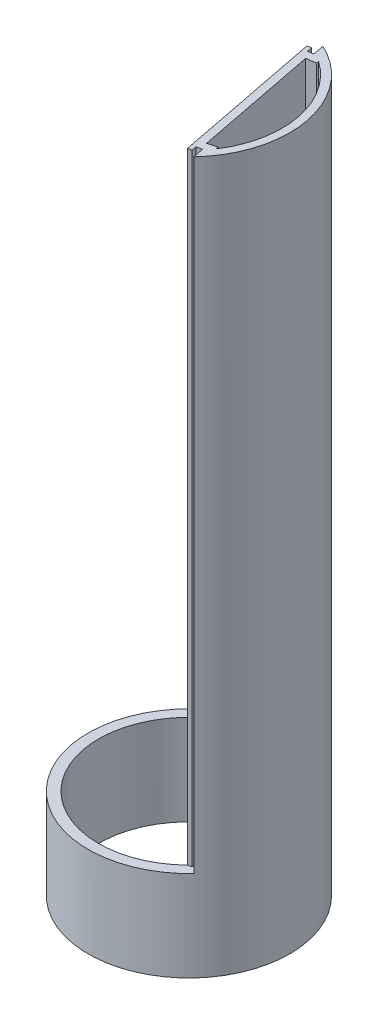
ISO-10303-21;
HEADER;
FILE_DESCRIPTION(('STEP AP214'),'2;1');
FILE_NAME('part.step','',(''),(''),'','','');
FILE_SCHEMA(('AUTOMOTIVE_DESIGN { 1 0 10303 214 1 1 1 1 }'));
ENDSEC;
DATA;
#1=APPLICATION_CONTEXT('core data for automotive mechanical design processes');
#2=APPLICATION_PROTOCOL_DEFINITION('international standard','automotive_design',2000,#1);
#3=PRODUCT_CONTEXT('',#1,'mechanical');
#4=PRODUCT('Part','Part','',(#3));
#5=PRODUCT_RELATED_PRODUCT_CATEGORY('part','',(#4));
#6=PRODUCT_DEFINITION_FORMATION('','',#4);
#7=PRODUCT_DEFINITION_CONTEXT('part definition',#1,'design');
#8=PRODUCT_DEFINITION('design','',#6,#7);
#9=PRODUCT_DEFINITION_SHAPE('','',#8);
#10=(LENGTH_UNIT() NAMED_UNIT(*) SI_UNIT(.MILLI.,.METRE.));
#11=(NAMED_UNIT(*) PLANE_ANGLE_UNIT() SI_UNIT($,.RADIAN.));
#12=(NAMED_UNIT(*) SI_UNIT($,.STERADIAN.) SOLID_ANGLE_UNIT());
#13=UNCERTAINTY_MEASURE_WITH_UNIT(LENGTH_MEASURE(1.E-05),#10,'distance_accuracy_value','');
#14=(GEOMETRIC_REPRESENTATION_CONTEXT(3) GLOBAL_UNCERTAINTY_ASSIGNED_CONTEXT((#13)) GLOBAL_UNIT_ASSIGNED_CONTEXT((#10,
#11,#12)) REPRESENTATION_CONTEXT('',''));
#15=CARTESIAN_POINT('',(0.,0.,0.));
#16=DIRECTION('',(0.,0.,1.));
#17=DIRECTION('',(1.,0.,0.));
#18=AXIS2_PLACEMENT_3D('',#15,#16,#17);
#19=CARTESIAN_POINT('',(0.,0.,0.));
#20=DIRECTION('',(0.,1.,0.));
#21=DIRECTION('',(0.,0.,1.));
#22=AXIS2_PLACEMENT_3D('',#19,#20,#21);
#23=PLANE('',#22);
#24=DIRECTION('',(-0.975925981886578,0.,0.218101989625766));
#25=VECTOR('',#24,1.);
#26=CARTESIAN_POINT('',(-3.12841036018677,0.,-13.9984828095705));
#27=LINE('',#26,#25);
#28=CARTESIAN_POINT('',(6.65548623982906,0.,-16.185008585461));
#29=VERTEX_POINT('',#28);
#30=CARTESIAN_POINT('',(6.62137484703319,0.,-16.1773852997039));
#31=VERTEX_POINT('',#30);
#32=EDGE_CURVE('E475',#29,#31,#27,.T.);
#33=ORIENTED_EDGE('',*,*,#32,.F.);
#34=CARTESIAN_POINT('',(0.,0.,0.));
#35=DIRECTION('',(0.,-1.,0.));
#36=DIRECTION('',(0.,0.,-1.));
#37=AXIS2_PLACEMENT_3D('',#34,#35,#36);
#38=CIRCLE('',#37,17.5);
#39=CARTESIAN_POINT('',(7.47812735893866,0.,-15.82174488492));
#40=VERTEX_POINT('',#39);
#41=EDGE_CURVE('E535',#29,#40,#38,.T.);
#42=ORIENTED_EDGE('',*,*,#41,.T.);
#43=DIRECTION('',(-0.192781226726572,0.,-0.981241763594374));
#44=VECTOR('',#43,1.);
#45=CARTESIAN_POINT('',(10.1931259637832,0.,-2.00260873556633));
#46=LINE('',#45,#44);
#47=CARTESIAN_POINT('',(7.5679937816583,0.,-15.3643316366767));
#48=VERTEX_POINT('',#47);
#49=EDGE_CURVE('E471',#48,#40,#46,.T.);
#50=ORIENTED_EDGE('',*,*,#49,.F.);
#51=DIRECTION('',(-0.989728291630021,0.,0.142961214135584));
#52=VECTOR('',#51,1.);
#53=CARTESIAN_POINT('',(-2.01926769541411,0.,-13.9795005142479));
#54=LINE('',#53,#52);
#55=CARTESIAN_POINT('',(8.20640860585505,0.,-15.4565474085822));
#56=VERTEX_POINT('',#55);
#57=EDGE_CURVE('E211',#56,#48,#54,.T.);
#58=ORIENTED_EDGE('',*,*,#57,.F.);
#59=CARTESIAN_POINT('',(10.1896789357499,0.,-14.227453854655));
#60=VERTEX_POINT('',#59);
#61=EDGE_CURVE('E543',#56,#60,#38,.T.);
#62=ORIENTED_EDGE('',*,*,#61,.T.);
#63=DIRECTION('',(-0.989728291630021,0.,0.142961214135584));
#64=VECTOR('',#63,1.);
#65=CARTESIAN_POINT('',(-1.80482587421073,0.,-12.4949080768028));
#66=LINE('',#65,#64);
#67=CARTESIAN_POINT('',(8.57569510727663,0.,-13.9943265489466));
#68=VERTEX_POINT('',#67);
#69=EDGE_CURVE('E48',#60,#68,#66,.T.);
#70=ORIENTED_EDGE('',*,*,#69,.T.);
#71=DIRECTION('',(0.191539053340963,0.,0.981484992776379));
#72=VECTOR('',#71,1.);
#73=CARTESIAN_POINT('',(10.8919130183371,0.,-2.12558187232489));
#74=LINE('',#73,#72);
#75=CARTESIAN_POINT('',(13.2175748249073,0.,9.79160745072392));
#76=VERTEX_POINT('',#75);
#77=EDGE_CURVE('E458',#68,#76,#74,.T.);
#78=ORIENTED_EDGE('',*,*,#77,.T.);
#79=DIRECTION('',(0.970961498510079,0.,-0.239235800855688));
#80=VECTOR('',#79,1.);
#81=CARTESIAN_POINT('',(3.03097069213249,0.,12.3014859592371));
#82=LINE('',#81,#80);
#83=CARTESIAN_POINT('',(14.7525570436051,0.,9.41339745509124));
#84=VERTEX_POINT('',#83);
#85=EDGE_CURVE('E454',#76,#84,#82,.T.);
#86=ORIENTED_EDGE('',*,*,#85,.T.);
#87=CARTESIAN_POINT('',(13.3618637974238,0.,11.3009112844538));
#88=VERTEX_POINT('',#87);
#89=EDGE_CURVE('E553',#84,#88,#38,.T.);
#90=ORIENTED_EDGE('',*,*,#89,.T.);
#91=DIRECTION('',(0.970961498510079,0.,-0.239235800855687));
#92=VECTOR('',#91,1.);
#93=CARTESIAN_POINT('',(3.389824393416,0.,13.7579282070022));
#94=LINE('',#93,#92);
#95=CARTESIAN_POINT('',(12.7901724394749,0.,11.4417706697858));
#96=VERTEX_POINT('',#95);
#97=EDGE_CURVE('E492',#96,#88,#94,.T.);
#98=ORIENTED_EDGE('',*,*,#97,.F.);
#99=DIRECTION('',(0.18965972085188,0.,0.981849881746893));
#100=VECTOR('',#99,1.);
#101=CARTESIAN_POINT('',(10.1994430867995,0.,-1.97018257541096));
#102=LINE('',#101,#100);
#103=CARTESIAN_POINT('',(12.8704805433585,0.,11.8575178930091));
#104=VERTEX_POINT('',#103);
#105=EDGE_CURVE('E488',#96,#104,#102,.T.);
#106=ORIENTED_EDGE('',*,*,#105,.T.);
#107=CARTESIAN_POINT('',(12.2520776805119,0.,12.4954628770086));
#108=VERTEX_POINT('',#107);
#109=EDGE_CURVE('E546',#104,#108,#38,.T.);
#110=ORIENTED_EDGE('',*,*,#109,.T.);
#111=DIRECTION('',(-0.987787271952142,0.,0.155808553582099));
#112=VECTOR('',#111,1.);
#113=CARTESIAN_POINT('',(2.22055821618433,0.,14.0777838709597));
#114=LINE('',#113,#112);
#115=CARTESIAN_POINT('',(12.2179962113119,0.,12.500838715077));
#116=VERTEX_POINT('',#115);
#117=EDGE_CURVE('E484',#108,#116,#114,.T.);
#118=ORIENTED_EDGE('',*,*,#117,.T.);
#119=DIRECTION('',(0.191539053340963,0.,0.981484992776379));
#120=VECTOR('',#119,1.);
#121=CARTESIAN_POINT('',(9.41968552917254,0.,-1.83827329231345));
#122=LINE('',#121,#120);
#123=EDGE_CURVE('E480',#31,#116,#122,.T.);
#124=ORIENTED_EDGE('',*,*,#123,.F.);
#125=EDGE_LOOP('',(#33,#42,#50,#58,#62,#70,#78,#86,#90,#98,#106,#110,#118,#124));
#126=FACE_BOUND('',#125,.T.);
#127=ADVANCED_FACE('F43',(#126),#23,.F.);
#128=CARTESIAN_POINT('',(0.,-7.5,0.));
#129=DIRECTION('',(0.,-1.,0.));
#130=DIRECTION('',(0.,0.,-1.));
#131=AXIS2_PLACEMENT_3D('',#128,#129,#130);
#132=PLANE('',#131);
#133=CARTESIAN_POINT('',(0.,-7.5,0.));
#134=DIRECTION('',(0.,-1.,0.));
#135=DIRECTION('',(0.,0.,-1.));
#136=AXIS2_PLACEMENT_3D('',#133,#134,#135);
#137=CIRCLE('',#136,17.5);
#138=CARTESIAN_POINT('',(14.7525571288397,-7.5,9.41339780102387));
#139=VERTEX_POINT('',#138);
#140=CARTESIAN_POINT('',(10.1896789357498,-7.5,-14.227453854655));
#141=VERTEX_POINT('',#140);
#142=EDGE_CURVE('E671',#139,#141,#137,.F.);
#143=ORIENTED_EDGE('',*,*,#142,.F.);
#144=DIRECTION('',(-0.970960849688507,0.,0.239238434145044));
#145=VECTOR('',#144,1.);
#146=CARTESIAN_POINT('',(15.0076653893873,-7.5,9.35054078592336));
#147=LINE('',#146,#145);
#148=CARTESIAN_POINT('',(13.2175748249073,-7.5,9.79160745072392));
#149=VERTEX_POINT('',#148);
#150=EDGE_CURVE('E366',#139,#149,#147,.T.);
#151=ORIENTED_EDGE('',*,*,#150,.T.);
#152=DIRECTION('',(-0.191539053340963,0.,-0.981484992776378));
#153=VECTOR('',#152,1.);
#154=CARTESIAN_POINT('',(13.2175748249073,-7.5,9.79160745072392));
#155=LINE('',#154,#153);
#156=CARTESIAN_POINT('',(8.57569510727663,-7.5,-13.9943265489466));
#157=VERTEX_POINT('',#156);
#158=EDGE_CURVE('E579',#149,#157,#155,.T.);
#159=ORIENTED_EDGE('',*,*,#158,.T.);
#160=DIRECTION('',(0.989728677158988,0.,-0.14295854507206));
#161=VECTOR('',#160,1.);
#162=CARTESIAN_POINT('',(8.57569510727663,-7.5,-13.9943265489466));
#163=LINE('',#162,#161);
#164=EDGE_CURVE('E576',#157,#141,#163,.T.);
#165=ORIENTED_EDGE('',*,*,#164,.T.);
#166=EDGE_LOOP('',(#143,#151,#159,#165));
#167=FACE_BOUND('',#166,.T.);
#168=ADVANCED_FACE('F614',(#167),#132,.T.);
#169=CARTESIAN_POINT('',(0.,120.,0.));
#170=DIRECTION('',(0.,-1.,0.));
#171=DIRECTION('',(0.,0.,-1.));
#172=AXIS2_PLACEMENT_3D('',#169,#170,#171);
#173=CYLINDRICAL_SURFACE('',#172,18.);
#174=CARTESIAN_POINT('',(10.3139243265065,120.,-14.7520495181889));
#175=DIRECTION('',(0.,-1.,0.));
#176=VECTOR('',#175,1.);
#177=LINE('',#174,#176);
#178=CARTESIAN_POINT('',(10.3139271914831,120.,-14.7520536159769));
#179=VERTEX_POINT('',#178);
#180=CARTESIAN_POINT('',(10.3139282120992,7.50000000000002,-14.752052049036));
#181=VERTEX_POINT('',#180);
#182=EDGE_CURVE('E243',#179,#181,#177,.T.);
#183=ORIENTED_EDGE('',*,*,#182,.T.);
#184=CARTESIAN_POINT('',(0.,7.5,0.));
#185=DIRECTION('',(0.,-1.,0.));
#186=DIRECTION('',(0.,0.,-1.));
#187=AXIS2_PLACEMENT_3D('',#184,#185,#186);
#188=CIRCLE('',#187,18.0000058687092);
#189=CARTESIAN_POINT('',(15.0959455703887,7.50000000000001,9.80370076091066));
#190=VERTEX_POINT('',#189);
#191=EDGE_CURVE('E370',#181,#190,#188,.T.);
#192=ORIENTED_EDGE('',*,*,#191,.T.);
#193=CARTESIAN_POINT('',(15.0959483956039,120.,9.80370259567907));
#194=DIRECTION('',(0.,-1.,0.));
#195=VECTOR('',#194,1.);
#196=LINE('',#193,#195);
#197=CARTESIAN_POINT('',(15.0959483956039,120.,9.80370259567907));
#198=VERTEX_POINT('',#197);
#199=EDGE_CURVE('E248',#198,#190,#196,.T.);
#200=ORIENTED_EDGE('',*,*,#199,.F.);
#201=CARTESIAN_POINT('',(0.,120.,0.));
#202=DIRECTION('',(0.,1.,0.));
#203=DIRECTION('',(0.,0.,1.));
#204=AXIS2_PLACEMENT_3D('',#201,#202,#203);
#205=CIRCLE('',#204,18.);
#206=EDGE_CURVE('E496',#198,#179,#205,.T.);
#207=ORIENTED_EDGE('',*,*,#206,.T.);
#208=EDGE_LOOP('',(#183,#192,#200,#207));
#209=FACE_BOUND('',#208,.T.);
#210=ADVANCED_FACE('F45',(#209),#173,.F.);
#211=CARTESIAN_POINT('',(12.7038817371665,120.,-2.47491480136262));
#212=DIRECTION('',(0.981547063544028,0.,-0.191220715530759));
#213=DIRECTION('',(-0.191220715530759,0.,-0.981547063544028));
#214=AXIS2_PLACEMENT_3D('',#211,#212,#213);
#215=PLANE('',#214);
#216=ORIENTED_EDGE('',*,*,#199,.T.);
#217=DIRECTION('',(-0.191219387528633,0.,-0.981547322258675));
#218=VECTOR('',#217,1.);
#219=CARTESIAN_POINT('',(15.0959476670456,7.5,9.80370212253435));
#220=LINE('',#219,#218);
#221=CARTESIAN_POINT('',(15.0076653893873,7.50000000000001,9.35054078592336));
#222=VERTEX_POINT('',#221);
#223=EDGE_CURVE('E373',#190,#222,#220,.T.);
#224=ORIENTED_EDGE('',*,*,#223,.T.);
#225=DIRECTION('',(0.,-1.,0.));
#226=VECTOR('',#225,1.);
#227=CARTESIAN_POINT('',(15.0076653893873,120.,9.35054078592336));
#228=LINE('',#227,#226);
#229=CARTESIAN_POINT('',(15.0076653893873,120.,9.35054078592336));
#230=VERTEX_POINT('',#229);
#231=EDGE_CURVE('E244',#230,#222,#228,.T.);
#232=ORIENTED_EDGE('',*,*,#231,.F.);
#233=DIRECTION('',(0.191220715530759,0.,0.981547063544028));
#234=VECTOR('',#233,1.);
#235=CARTESIAN_POINT('',(12.7038817371665,120.,-2.47491480136262));
#236=LINE('',#235,#234);
#237=EDGE_CURVE('E597',#230,#198,#236,.T.);
#238=ORIENTED_EDGE('',*,*,#237,.T.);
#239=EDGE_LOOP('',(#216,#224,#232,#238));
#240=FACE_BOUND('',#239,.T.);
#241=ADVANCED_FACE('F341',(#240),#215,.T.);
#242=CARTESIAN_POINT('',(3.03097069213249,120.,12.3014859592371));
#243=DIRECTION('',(-0.239235800855688,0.,-0.970961498510079));
#244=DIRECTION('',(-0.970961498510079,0.,0.239235800855688));
#245=AXIS2_PLACEMENT_3D('',#242,#243,#244);
#246=PLANE('',#245);
#247=ORIENTED_EDGE('',*,*,#231,.T.);
#248=DIRECTION('',(-0.970960849688507,0.,0.239238434145044));
#249=VECTOR('',#248,1.);
#250=CARTESIAN_POINT('',(15.0076653893873,7.5,9.35054078592336));
#251=LINE('',#250,#249);
#252=CARTESIAN_POINT('',(13.2175766805302,7.50000000000001,9.79160454447254));
#253=VERTEX_POINT('',#252);
#254=EDGE_CURVE('E379',#222,#253,#251,.T.);
#255=ORIENTED_EDGE('',*,*,#254,.T.);
#256=CARTESIAN_POINT('',(13.2175797323322,120.,9.79160649302865));
#257=DIRECTION('',(0.,-1.,0.));
#258=VECTOR('',#257,1.);
#259=LINE('',#256,#258);
#260=CARTESIAN_POINT('',(13.2175748249073,120.,9.79160745072392));
#261=VERTEX_POINT('',#260);
#262=EDGE_CURVE('E249',#261,#253,#259,.T.);
#263=ORIENTED_EDGE('',*,*,#262,.F.);
#264=DIRECTION('',(0.970961498510079,0.,-0.239235800855688));
#265=VECTOR('',#264,1.);
#266=CARTESIAN_POINT('',(3.03097069213249,120.,12.3014859592371));
#267=LINE('',#266,#265);
#268=EDGE_CURVE('E414',#261,#230,#267,.T.);
#269=ORIENTED_EDGE('',*,*,#268,.T.);
#270=EDGE_LOOP('',(#247,#255,#263,#269));
#271=FACE_BOUND('',#270,.T.);
#272=ADVANCED_FACE('F333',(#271),#246,.T.);
#273=CARTESIAN_POINT('',(10.8919130183371,120.,-2.12558187232489));
#274=DIRECTION('',(0.981484992776378,0.,-0.191539053340963));
#275=DIRECTION('',(-0.191539053340963,0.,-0.981484992776379));
#276=AXIS2_PLACEMENT_3D('',#273,#274,#275);
#277=PLANE('',#276);
#278=ORIENTED_EDGE('',*,*,#262,.T.);
#279=DIRECTION('',(-0.191539053340963,0.,-0.981484992776378));
#280=VECTOR('',#279,1.);
#281=CARTESIAN_POINT('',(13.2175748249073,7.5,9.79160745072392));
#282=LINE('',#281,#280);
#283=CARTESIAN_POINT('',(8.57569791839214,7.50000000000001,-13.9943245534735));
#284=VERTEX_POINT('',#283);
#285=EDGE_CURVE('E384',#253,#284,#282,.T.);
#286=ORIENTED_EDGE('',*,*,#285,.T.);
#287=CARTESIAN_POINT('',(8.5756958220827,120.,-13.9943216003051));
#288=DIRECTION('',(0.,-1.,0.));
#289=VECTOR('',#288,1.);
#290=LINE('',#287,#289);
#291=CARTESIAN_POINT('',(8.57569510727663,120.,-13.9943265489466));
#292=VERTEX_POINT('',#291);
#293=EDGE_CURVE('E242',#292,#284,#290,.T.);
#294=ORIENTED_EDGE('',*,*,#293,.F.);
#295=DIRECTION('',(0.191539053340963,0.,0.981484992776379));
#296=VECTOR('',#295,1.);
#297=CARTESIAN_POINT('',(10.8919130183371,120.,-2.12558187232489));
#298=LINE('',#297,#296);
#299=EDGE_CURVE('E410',#292,#261,#298,.T.);
#300=ORIENTED_EDGE('',*,*,#299,.T.);
#301=EDGE_LOOP('',(#278,#286,#294,#300));
#302=FACE_BOUND('',#301,.T.);
#303=ADVANCED_FACE('F289',(#302),#277,.T.);
#304=CARTESIAN_POINT('',(-1.80482587421073,120.,-12.4949080768028));
#305=DIRECTION('',(0.142961214135584,0.,0.989728291630021));
#306=DIRECTION('',(0.989728291630021,0.,-0.142961214135584));
#307=AXIS2_PLACEMENT_3D('',#304,#305,#306);
#308=PLANE('',#307);
#309=ORIENTED_EDGE('',*,*,#293,.T.);
#310=DIRECTION('',(0.989728677158988,0.,-0.14295854507206));
#311=VECTOR('',#310,1.);
#312=CARTESIAN_POINT('',(8.57569510727663,7.5,-13.9943265489466));
#313=LINE('',#312,#311);
#314=CARTESIAN_POINT('',(10.4107257360963,7.5,-14.2593823313169));
#315=VERTEX_POINT('',#314);
#316=EDGE_CURVE('E367',#284,#315,#313,.T.);
#317=ORIENTED_EDGE('',*,*,#316,.T.);
#318=DIRECTION('',(0.,-1.,0.));
#319=VECTOR('',#318,1.);
#320=CARTESIAN_POINT('',(10.4107257360963,120.,-14.2593823313169));
#321=LINE('',#320,#319);
#322=CARTESIAN_POINT('',(10.4107257360963,120.,-14.2593823313169));
#323=VERTEX_POINT('',#322);
#324=EDGE_CURVE('E239',#323,#315,#321,.T.);
#325=ORIENTED_EDGE('',*,*,#324,.F.);
#326=DIRECTION('',(-0.989728291630021,0.,0.142961214135584));
#327=VECTOR('',#326,1.);
#328=CARTESIAN_POINT('',(-1.80482587421073,120.,-12.4949080768028));
#329=LINE('',#328,#327);
#330=EDGE_CURVE('E406',#323,#292,#329,.T.);
#331=ORIENTED_EDGE('',*,*,#330,.T.);
#332=EDGE_LOOP('',(#309,#317,#325,#331));
#333=FACE_BOUND('',#332,.T.);
#334=ADVANCED_FACE('F284',(#333),#308,.T.);
#335=CARTESIAN_POINT('',(12.7211911930149,120.,-2.49928909938485));
#336=DIRECTION('',(-0.981241763594376,0.,0.192781226726565));
#337=DIRECTION('',(0.192781226726565,0.,0.981241763594376));
#338=AXIS2_PLACEMENT_3D('',#335,#336,#337);
#339=PLANE('',#338);
#340=DIRECTION('',(-0.192789775486946,0.,-0.981240084009868));
#341=VECTOR('',#340,1.);
#342=CARTESIAN_POINT('',(10.4107257360963,7.5,-14.2593823313169));
#343=LINE('',#342,#341);
#344=EDGE_CURVE('E358',#315,#181,#343,.T.);
#345=ORIENTED_EDGE('',*,*,#344,.T.);
#346=ORIENTED_EDGE('',*,*,#182,.F.);
#347=DIRECTION('',(-0.192781226726565,0.,-0.981241763594376));
#348=VECTOR('',#347,1.);
#349=CARTESIAN_POINT('',(12.7211911930149,120.,-2.49928909938485));
#350=LINE('',#349,#348);
#351=EDGE_CURVE('E401',#323,#179,#350,.T.);
#352=ORIENTED_EDGE('',*,*,#351,.F.);
#353=ORIENTED_EDGE('',*,*,#324,.T.);
#354=EDGE_LOOP('',(#345,#346,#352,#353));
#355=FACE_BOUND('',#354,.T.);
#356=ADVANCED_FACE('F273',(#355),#339,.F.);
#357=CARTESIAN_POINT('',(11.2315611418504,120.,-2.18808372806657));
#358=DIRECTION('',(0.981547063544026,0.,-0.191220715530769));
#359=DIRECTION('',(-0.191220715530769,0.,-0.981547063544026));
#360=AXIS2_PLACEMENT_3D('',#357,#358,#359);
#361=PLANE('',#360);
#362=DIRECTION('',(0.191220715530769,0.,0.981547063544026));
#363=VECTOR('',#362,1.);
#364=CARTESIAN_POINT('',(11.2315611418504,0.,-2.18808372806657));
#365=LINE('',#364,#363);
#366=CARTESIAN_POINT('',(13.836638734924,0.,11.1839311955694));
#367=VERTEX_POINT('',#366);
#368=CARTESIAN_POINT('',(14.2508770441302,0.,13.3102405490315));
#369=VERTEX_POINT('',#368);
#370=EDGE_CURVE('E212',#367,#369,#365,.T.);
#371=ORIENTED_EDGE('',*,*,#370,.T.);
#372=DIRECTION('',(0.,-1.,0.));
#373=VECTOR('',#372,1.);
#374=CARTESIAN_POINT('',(14.2508770441302,120.,13.3102405490315));
#375=LINE('',#374,#373);
#376=CARTESIAN_POINT('',(14.2508770441302,120.,13.3102405490315));
#377=VERTEX_POINT('',#376);
#378=EDGE_CURVE('E55',#377,#369,#375,.T.);
#379=ORIENTED_EDGE('',*,*,#378,.F.);
#380=DIRECTION('',(0.191220715530769,0.,0.981547063544026));
#381=VECTOR('',#380,1.);
#382=CARTESIAN_POINT('',(11.2315611418504,120.,-2.18808372806657));
#383=LINE('',#382,#381);
#384=CARTESIAN_POINT('',(13.836638734924,120.,11.1839311955694));
#385=VERTEX_POINT('',#384);
#386=EDGE_CURVE('E405',#385,#377,#383,.T.);
#387=ORIENTED_EDGE('',*,*,#386,.F.);
#388=DIRECTION('',(0.,-1.,0.));
#389=VECTOR('',#388,1.);
#390=CARTESIAN_POINT('',(13.836638734924,120.,11.1839311955694));
#391=LINE('',#390,#389);
#392=EDGE_CURVE('E497',#385,#367,#391,.T.);
#393=ORIENTED_EDGE('',*,*,#392,.T.);
#394=EDGE_LOOP('',(#371,#379,#387,#393));
#395=FACE_BOUND('',#394,.T.);
#396=ADVANCED_FACE('F283',(#395),#361,.F.);
#397=CARTESIAN_POINT('',(0.,120.,0.));
#398=DIRECTION('',(0.,-1.,0.));
#399=DIRECTION('',(0.,0.,-1.));
#400=AXIS2_PLACEMENT_3D('',#397,#398,#399);
#401=CYLINDRICAL_SURFACE('',#400,19.5);
#402=ORIENTED_EDGE('',*,*,#378,.T.);
#403=CARTESIAN_POINT('',(0.,0.,0.));
#404=DIRECTION('',(0.,-1.,0.));
#405=DIRECTION('',(0.,0.,-1.));
#406=AXIS2_PLACEMENT_3D('',#403,#404,#405);
#407=CIRCLE('',#406,19.5);
#408=CARTESIAN_POINT('',(8.20840412004759,0.,-17.6881910268401));
#409=VERTEX_POINT('',#408);
#410=EDGE_CURVE('E203',#369,#409,#407,.T.);
#411=ORIENTED_EDGE('',*,*,#410,.T.);
#412=DIRECTION('',(0.,-1.,0.));
#413=VECTOR('',#412,1.);
#414=CARTESIAN_POINT('',(8.2084041200476,120.,-17.6881910268401));
#415=LINE('',#414,#413);
#416=CARTESIAN_POINT('',(8.2084041200476,120.,-17.6881910268401));
#417=VERTEX_POINT('',#416);
#418=EDGE_CURVE('E218',#417,#409,#415,.T.);
#419=ORIENTED_EDGE('',*,*,#418,.F.);
#420=CARTESIAN_POINT('',(0.,120.,0.));
#421=DIRECTION('',(0.,1.,0.));
#422=DIRECTION('',(0.,0.,1.));
#423=AXIS2_PLACEMENT_3D('',#420,#421,#422);
#424=CIRCLE('',#423,19.5);
#425=EDGE_CURVE('E426',#377,#417,#424,.T.);
#426=ORIENTED_EDGE('',*,*,#425,.F.);
#427=EDGE_LOOP('',(#402,#411,#419,#426));
#428=FACE_BOUND('',#427,.T.);
#429=CARTESIAN_POINT('',(0.,-17.5,0.));
#430=DIRECTION('',(0.,-1.,0.));
#431=DIRECTION('',(0.,0.,-1.));
#432=AXIS2_PLACEMENT_3D('',#429,#430,#431);
#433=CIRCLE('',#432,19.5);
#434=CARTESIAN_POINT('',(0.,-17.5,-19.5));
#435=VERTEX_POINT('',#434);
#436=EDGE_CURVE('E223',#435,#435,#433,.T.);
#437=ORIENTED_EDGE('',*,*,#436,.F.);
#438=EDGE_LOOP('',(#437));
#439=FACE_BOUND('',#438,.T.);
#440=ADVANCED_FACE('F216',(#428,#439),#401,.T.);
#441=CARTESIAN_POINT('',(11.2493285476234,120.,-2.21011725929506));
#442=DIRECTION('',(-0.981241763594375,0.,0.19278122672657));
#443=DIRECTION('',(0.19278122672657,0.,0.981241763594375));
#444=AXIS2_PLACEMENT_3D('',#441,#442,#443);
#445=PLANE('',#444);
#446=DIRECTION('',(-0.19278122672657,0.,-0.981241763594375));
#447=VECTOR('',#446,1.);
#448=CARTESIAN_POINT('',(11.2493285476234,0.,-2.21011725929506));
#449=LINE('',#448,#447);
#450=CARTESIAN_POINT('',(8.63469341661494,0.,-15.5184109695815));
#451=VERTEX_POINT('',#450);
#452=EDGE_CURVE('E200',#451,#409,#449,.T.);
#453=ORIENTED_EDGE('',*,*,#452,.F.);
#454=DIRECTION('',(0.,-1.,0.));
#455=VECTOR('',#454,1.);
#456=CARTESIAN_POINT('',(8.63469341661494,120.,-15.5184109695815));
#457=LINE('',#456,#455);
#458=CARTESIAN_POINT('',(8.63469341661494,120.,-15.5184109695815));
#459=VERTEX_POINT('',#458);
#460=EDGE_CURVE('E230',#459,#451,#457,.T.);
#461=ORIENTED_EDGE('',*,*,#460,.F.);
#462=DIRECTION('',(-0.19278122672657,0.,-0.981241763594375));
#463=VECTOR('',#462,1.);
#464=CARTESIAN_POINT('',(11.2493285476234,120.,-2.21011725929506));
#465=LINE('',#464,#463);
#466=EDGE_CURVE('E228',#459,#417,#465,.T.);
#467=ORIENTED_EDGE('',*,*,#466,.T.);
#468=ORIENTED_EDGE('',*,*,#418,.T.);
#469=EDGE_LOOP('',(#453,#461,#467,#468));
#470=FACE_BOUND('',#469,.T.);
#471=ADVANCED_FACE('F226',(#470),#445,.T.);
#472=CARTESIAN_POINT('',(-2.01926769541411,120.,-13.9795005142479));
#473=DIRECTION('',(0.142961214135584,0.,0.989728291630021));
#474=DIRECTION('',(0.989728291630021,0.,-0.142961214135584));
#475=AXIS2_PLACEMENT_3D('',#472,#473,#474);
#476=PLANE('',#475);
#477=EDGE_CURVE('E206',#451,#56,#54,.T.);
#478=ORIENTED_EDGE('',*,*,#477,.T.);
#479=ORIENTED_EDGE('',*,*,#57,.T.);
#480=DIRECTION('',(0.,-1.,0.));
#481=VECTOR('',#480,1.);
#482=CARTESIAN_POINT('',(7.5679937816583,120.,-15.3643316366767));
#483=LINE('',#482,#481);
#484=CARTESIAN_POINT('',(7.5679937816583,120.,-15.3643316366767));
#485=VERTEX_POINT('',#484);
#486=EDGE_CURVE('E235',#485,#48,#483,.T.);
#487=ORIENTED_EDGE('',*,*,#486,.F.);
#488=DIRECTION('',(-0.989728291630021,0.,0.142961214135584));
#489=VECTOR('',#488,1.);
#490=CARTESIAN_POINT('',(-2.01926769541411,120.,-13.9795005142479));
#491=LINE('',#490,#489);
#492=EDGE_CURVE('E431',#459,#485,#491,.T.);
#493=ORIENTED_EDGE('',*,*,#492,.F.);
#494=ORIENTED_EDGE('',*,*,#460,.T.);
#495=EDGE_LOOP('',(#478,#479,#487,#493,#494));
#496=FACE_BOUND('',#495,.T.);
#497=ADVANCED_FACE('F645',(#496),#476,.F.);
#498=CARTESIAN_POINT('',(10.1931259637832,120.,-2.00260873556633));
#499=DIRECTION('',(-0.981241763594374,0.,0.192781226726572));
#500=DIRECTION('',(0.192781226726572,0.,0.981241763594374));
#501=AXIS2_PLACEMENT_3D('',#498,#499,#500);
#502=PLANE('',#501);
#503=ORIENTED_EDGE('',*,*,#49,.T.);
#504=DIRECTION('',(0.192781226726572,0.,0.981241763594374));
#505=VECTOR('',#504,1.);
#506=CARTESIAN_POINT('',(10.1931259637832,0.,-2.00260873556633));
#507=LINE('',#506,#505);
#508=CARTESIAN_POINT('',(7.37515964446208,0.,-16.3458427105324));
#509=VERTEX_POINT('',#508);
#510=EDGE_CURVE('E666',#509,#40,#507,.T.);
#511=ORIENTED_EDGE('',*,*,#510,.F.);
#512=DIRECTION('',(0.,-1.,0.));
#513=VECTOR('',#512,1.);
#514=CARTESIAN_POINT('',(7.37515964446208,120.,-16.3458427105324));
#515=LINE('',#514,#513);
#516=CARTESIAN_POINT('',(7.37515964446208,120.,-16.3458427105324));
#517=VERTEX_POINT('',#516);
#518=EDGE_CURVE('E516',#517,#509,#515,.T.);
#519=ORIENTED_EDGE('',*,*,#518,.F.);
#520=DIRECTION('',(-0.192781226726572,0.,-0.981241763594374));
#521=VECTOR('',#520,1.);
#522=CARTESIAN_POINT('',(10.1931259637832,120.,-2.00260873556633));
#523=LINE('',#522,#521);
#524=EDGE_CURVE('E434',#485,#517,#523,.T.);
#525=ORIENTED_EDGE('',*,*,#524,.F.);
#526=ORIENTED_EDGE('',*,*,#486,.T.);
#527=EDGE_LOOP('',(#503,#511,#519,#525,#526));
#528=FACE_BOUND('',#527,.T.);
#529=ADVANCED_FACE('F525',(#528),#502,.F.);
#530=CARTESIAN_POINT('',(-3.12841036018677,120.,-13.9984828095705));
#531=DIRECTION('',(0.218101989625766,0.,0.975925981886578));
#532=DIRECTION('',(0.975925981886578,0.,-0.218101989625766));
#533=AXIS2_PLACEMENT_3D('',#530,#531,#532);
#534=PLANE('',#533);
#535=EDGE_CURVE('E476',#509,#29,#27,.T.);
#536=ORIENTED_EDGE('',*,*,#535,.T.);
#537=ORIENTED_EDGE('',*,*,#32,.T.);
#538=DIRECTION('',(0.,-1.,0.));
#539=VECTOR('',#538,1.);
#540=CARTESIAN_POINT('',(6.62137484703319,120.,-16.1773852997039));
#541=LINE('',#540,#539);
#542=CARTESIAN_POINT('',(6.62137484703319,120.,-16.1773852997039));
#543=VERTEX_POINT('',#542);
#544=EDGE_CURVE('E512',#543,#31,#541,.T.);
#545=ORIENTED_EDGE('',*,*,#544,.F.);
#546=DIRECTION('',(-0.975925981886578,0.,0.218101989625766));
#547=VECTOR('',#546,1.);
#548=CARTESIAN_POINT('',(-3.12841036018677,120.,-13.9984828095705));
#549=LINE('',#548,#547);
#550=EDGE_CURVE('E437',#517,#543,#549,.T.);
#551=ORIENTED_EDGE('',*,*,#550,.F.);
#552=ORIENTED_EDGE('',*,*,#518,.T.);
#553=EDGE_LOOP('',(#536,#537,#545,#551,#552));
#554=FACE_BOUND('',#553,.T.);
#555=ADVANCED_FACE('F638',(#554),#534,.F.);
#556=CARTESIAN_POINT('',(9.41968552917254,120.,-1.83827329231345));
#557=DIRECTION('',(0.981484992776378,0.,-0.191539053340963));
#558=DIRECTION('',(-0.191539053340963,0.,-0.981484992776379));
#559=AXIS2_PLACEMENT_3D('',#556,#557,#558);
#560=PLANE('',#559);
#561=ORIENTED_EDGE('',*,*,#123,.T.);
#562=DIRECTION('',(0.,-1.,0.));
#563=VECTOR('',#562,1.);
#564=CARTESIAN_POINT('',(12.2179962113119,120.,12.500838715077));
#565=LINE('',#564,#563);
#566=CARTESIAN_POINT('',(12.2179962113119,120.,12.500838715077));
#567=VERTEX_POINT('',#566);
#568=EDGE_CURVE('E508',#567,#116,#565,.T.);
#569=ORIENTED_EDGE('',*,*,#568,.F.);
#570=DIRECTION('',(0.191539053340963,0.,0.981484992776379));
#571=VECTOR('',#570,1.);
#572=CARTESIAN_POINT('',(9.41968552917254,120.,-1.83827329231345));
#573=LINE('',#572,#571);
#574=EDGE_CURVE('E440',#543,#567,#573,.T.);
#575=ORIENTED_EDGE('',*,*,#574,.F.);
#576=ORIENTED_EDGE('',*,*,#544,.T.);
#577=EDGE_LOOP('',(#561,#569,#575,#576));
#578=FACE_BOUND('',#577,.T.);
#579=ADVANCED_FACE('F634',(#578),#560,.F.);
#580=CARTESIAN_POINT('',(2.22055821618433,120.,14.0777838709597));
#581=DIRECTION('',(0.155808553582099,0.,0.987787271952142));
#582=DIRECTION('',(0.987787271952142,0.,-0.155808553582099));
#583=AXIS2_PLACEMENT_3D('',#580,#581,#582);
#584=PLANE('',#583);
#585=CARTESIAN_POINT('',(12.9717810087409,0.,12.3819405248144));
#586=VERTEX_POINT('',#585);
#587=EDGE_CURVE('E485',#586,#108,#114,.T.);
#588=ORIENTED_EDGE('',*,*,#587,.F.);
#589=DIRECTION('',(0.,-1.,0.));
#590=VECTOR('',#589,1.);
#591=CARTESIAN_POINT('',(12.9717810087409,120.,12.3819405248144));
#592=LINE('',#591,#590);
#593=CARTESIAN_POINT('',(12.9717810087409,120.,12.3819405248144));
#594=VERTEX_POINT('',#593);
#595=EDGE_CURVE('E504',#594,#586,#592,.T.);
#596=ORIENTED_EDGE('',*,*,#595,.F.);
#597=DIRECTION('',(-0.987787271952142,0.,0.155808553582099));
#598=VECTOR('',#597,1.);
#599=CARTESIAN_POINT('',(2.22055821618433,120.,14.0777838709597));
#600=LINE('',#599,#598);
#601=EDGE_CURVE('E443',#594,#567,#600,.T.);
#602=ORIENTED_EDGE('',*,*,#601,.T.);
#603=ORIENTED_EDGE('',*,*,#568,.T.);
#604=ORIENTED_EDGE('',*,*,#117,.F.);
#605=EDGE_LOOP('',(#588,#596,#602,#603,#604));
#606=FACE_BOUND('',#605,.T.);
#607=ADVANCED_FACE('F630',(#606),#584,.T.);
#608=CARTESIAN_POINT('',(10.1994430867995,120.,-1.97018257541096));
#609=DIRECTION('',(0.981849881746892,0.,-0.18965972085188));
#610=DIRECTION('',(-0.18965972085188,0.,-0.981849881746892));
#611=AXIS2_PLACEMENT_3D('',#608,#609,#610);
#612=PLANE('',#611);
#613=ORIENTED_EDGE('',*,*,#105,.F.);
#614=DIRECTION('',(0.,-1.,0.));
#615=VECTOR('',#614,1.);
#616=CARTESIAN_POINT('',(12.7901724394749,120.,11.4417706697858));
#617=LINE('',#616,#615);
#618=CARTESIAN_POINT('',(12.7901724394749,120.,11.4417706697858));
#619=VERTEX_POINT('',#618);
#620=EDGE_CURVE('E501',#619,#96,#617,.T.);
#621=ORIENTED_EDGE('',*,*,#620,.F.);
#622=DIRECTION('',(0.18965972085188,0.,0.981849881746893));
#623=VECTOR('',#622,1.);
#624=CARTESIAN_POINT('',(10.1994430867995,120.,-1.97018257541096));
#625=LINE('',#624,#623);
#626=EDGE_CURVE('E447',#619,#594,#625,.T.);
#627=ORIENTED_EDGE('',*,*,#626,.T.);
#628=ORIENTED_EDGE('',*,*,#595,.T.);
#629=DIRECTION('',(-0.18965972085188,0.,-0.981849881746892));
#630=VECTOR('',#629,1.);
#631=CARTESIAN_POINT('',(10.1994430867995,0.,-1.97018257541096));
#632=LINE('',#631,#630);
#633=EDGE_CURVE('E662',#586,#104,#632,.T.);
#634=ORIENTED_EDGE('',*,*,#633,.T.);
#635=EDGE_LOOP('',(#613,#621,#627,#628,#634));
#636=FACE_BOUND('',#635,.T.);
#637=ADVANCED_FACE('F626',(#636),#612,.T.);
#638=CARTESIAN_POINT('',(3.389824393416,120.,13.7579282070022));
#639=DIRECTION('',(-0.239235800855687,0.,-0.970961498510079));
#640=DIRECTION('',(-0.970961498510079,0.,0.239235800855687));
#641=AXIS2_PLACEMENT_3D('',#638,#639,#640);
#642=PLANE('',#641);
#643=ORIENTED_EDGE('',*,*,#97,.T.);
#644=DIRECTION('',(-0.970961498510079,0.,0.239235800855687));
#645=VECTOR('',#644,1.);
#646=CARTESIAN_POINT('',(3.389824393416,0.,13.7579282070022));
#647=LINE('',#646,#645);
#648=EDGE_CURVE('E659',#367,#88,#647,.T.);
#649=ORIENTED_EDGE('',*,*,#648,.F.);
#650=ORIENTED_EDGE('',*,*,#392,.F.);
#651=DIRECTION('',(0.970961498510079,0.,-0.239235800855687));
#652=VECTOR('',#651,1.);
#653=CARTESIAN_POINT('',(3.389824393416,120.,13.7579282070022));
#654=LINE('',#653,#652);
#655=EDGE_CURVE('E451',#619,#385,#654,.T.);
#656=ORIENTED_EDGE('',*,*,#655,.F.);
#657=ORIENTED_EDGE('',*,*,#620,.T.);
#658=EDGE_LOOP('',(#643,#649,#650,#656,#657));
#659=FACE_BOUND('',#658,.T.);
#660=ADVANCED_FACE('F623',(#659),#642,.F.);
#661=CARTESIAN_POINT('',(0.,120.,0.));
#662=DIRECTION('',(0.,1.,0.));
#663=DIRECTION('',(0.,0.,1.));
#664=AXIS2_PLACEMENT_3D('',#661,#662,#663);
#665=PLANE('',#664);
#666=ORIENTED_EDGE('',*,*,#206,.F.);
#667=ORIENTED_EDGE('',*,*,#237,.F.);
#668=ORIENTED_EDGE('',*,*,#268,.F.);
#669=ORIENTED_EDGE('',*,*,#299,.F.);
#670=ORIENTED_EDGE('',*,*,#330,.F.);
#671=ORIENTED_EDGE('',*,*,#351,.T.);
#672=EDGE_LOOP('',(#666,#667,#668,#669,#670,#671));
#673=FACE_BOUND('',#672,.T.);
#674=ORIENTED_EDGE('',*,*,#386,.T.);
#675=ORIENTED_EDGE('',*,*,#425,.T.);
#676=ORIENTED_EDGE('',*,*,#466,.F.);
#677=ORIENTED_EDGE('',*,*,#492,.T.);
#678=ORIENTED_EDGE('',*,*,#524,.T.);
#679=ORIENTED_EDGE('',*,*,#550,.T.);
#680=ORIENTED_EDGE('',*,*,#574,.T.);
#681=ORIENTED_EDGE('',*,*,#601,.F.);
#682=ORIENTED_EDGE('',*,*,#626,.F.);
#683=ORIENTED_EDGE('',*,*,#655,.T.);
#684=EDGE_LOOP('',(#674,#675,#676,#677,#678,#679,#680,#681,#682,#683));
#685=FACE_BOUND('',#684,.T.);
#686=ADVANCED_FACE('F408',(#673,#685),#665,.T.);
#687=CARTESIAN_POINT('',(8.57569510727663,-7.5,-13.9943265489466));
#688=DIRECTION('',(0.14295854507206,0.,0.989728677158988));
#689=DIRECTION('',(0.989728677158988,0.,-0.14295854507206));
#690=AXIS2_PLACEMENT_3D('',#687,#688,#689);
#691=PLANE('',#690);
#692=ORIENTED_EDGE('',*,*,#69,.F.);
#693=DIRECTION('',(0.,1.,0.));
#694=VECTOR('',#693,1.);
#695=CARTESIAN_POINT('',(10.1896789357498,-17.5,-14.2274538546549));
#696=LINE('',#695,#694);
#697=EDGE_CURVE('E374',#60,#141,#696,.F.);
#698=ORIENTED_EDGE('',*,*,#697,.T.);
#699=ORIENTED_EDGE('',*,*,#164,.F.);
#700=DIRECTION('',(0.,1.,0.));
#701=VECTOR('',#700,1.);
#702=CARTESIAN_POINT('',(8.57569510727663,-7.5,-13.9943265489466));
#703=LINE('',#702,#701);
#704=EDGE_CURVE('E569',#157,#68,#703,.T.);
#705=ORIENTED_EDGE('',*,*,#704,.T.);
#706=EDGE_LOOP('',(#692,#698,#699,#705));
#707=FACE_BOUND('',#706,.T.);
#708=ADVANCED_FACE('F565',(#707),#691,.F.);
#709=CARTESIAN_POINT('',(13.2175748249073,-7.5,9.79160745072392));
#710=DIRECTION('',(0.981484992776378,0.,-0.191539053340963));
#711=DIRECTION('',(-0.191539053340963,0.,-0.981484992776379));
#712=AXIS2_PLACEMENT_3D('',#709,#710,#711);
#713=PLANE('',#712);
#714=DIRECTION('',(0.,1.,0.));
#715=VECTOR('',#714,1.);
#716=CARTESIAN_POINT('',(13.2175748249073,-7.5,9.79160745072392));
#717=LINE('',#716,#715);
#718=EDGE_CURVE('E459',#149,#76,#717,.T.);
#719=ORIENTED_EDGE('',*,*,#718,.T.);
#720=ORIENTED_EDGE('',*,*,#77,.F.);
#721=ORIENTED_EDGE('',*,*,#704,.F.);
#722=ORIENTED_EDGE('',*,*,#158,.F.);
#723=EDGE_LOOP('',(#719,#720,#721,#722));
#724=FACE_BOUND('',#723,.T.);
#725=ADVANCED_FACE('F680',(#724),#713,.F.);
#726=CARTESIAN_POINT('',(15.0076653893873,-7.5,9.35054078592336));
#727=DIRECTION('',(-0.239238434145044,0.,-0.970960849688507));
#728=DIRECTION('',(-0.970960849688507,0.,0.239238434145044));
#729=AXIS2_PLACEMENT_3D('',#726,#727,#728);
#730=PLANE('',#729);
#731=ORIENTED_EDGE('',*,*,#150,.F.);
#732=DIRECTION('',(0.,1.,0.));
#733=VECTOR('',#732,1.);
#734=CARTESIAN_POINT('',(14.7525571288397,-17.5,9.41339780102387));
#735=LINE('',#734,#733);
#736=EDGE_CURVE('E11',#139,#84,#735,.T.);
#737=ORIENTED_EDGE('',*,*,#736,.T.);
#738=ORIENTED_EDGE('',*,*,#85,.F.);
#739=ORIENTED_EDGE('',*,*,#718,.F.);
#740=EDGE_LOOP('',(#731,#737,#738,#739));
#741=FACE_BOUND('',#740,.T.);
#742=ADVANCED_FACE('F676',(#741),#730,.F.);
#743=CARTESIAN_POINT('',(0.,7.5,0.));
#744=DIRECTION('',(0.,-1.,0.));
#745=DIRECTION('',(0.,0.,-1.));
#746=AXIS2_PLACEMENT_3D('',#743,#744,#745);
#747=PLANE('',#746);
#748=ORIENTED_EDGE('',*,*,#191,.F.);
#749=ORIENTED_EDGE('',*,*,#344,.F.);
#750=ORIENTED_EDGE('',*,*,#316,.F.);
#751=ORIENTED_EDGE('',*,*,#285,.F.);
#752=ORIENTED_EDGE('',*,*,#254,.F.);
#753=ORIENTED_EDGE('',*,*,#223,.F.);
#754=EDGE_LOOP('',(#748,#749,#750,#751,#752,#753));
#755=FACE_BOUND('',#754,.T.);
#756=ADVANCED_FACE('F399',(#755),#747,.F.);
#757=CARTESIAN_POINT('',(0.,-17.5,0.));
#758=DIRECTION('',(0.,1.,0.));
#759=DIRECTION('',(0.,0.,1.));
#760=AXIS2_PLACEMENT_3D('',#757,#758,#759);
#761=CYLINDRICAL_SURFACE('',#760,17.5);
#762=CARTESIAN_POINT('',(0.,-17.5,0.));
#763=DIRECTION('',(0.,-1.,0.));
#764=DIRECTION('',(0.,0.,-1.));
#765=AXIS2_PLACEMENT_3D('',#762,#763,#764);
#766=CIRCLE('',#765,17.5);
#767=CARTESIAN_POINT('',(0.,-17.5,-17.5));
#768=VERTEX_POINT('',#767);
#769=EDGE_CURVE('E224',#768,#768,#766,.T.);
#770=ORIENTED_EDGE('',*,*,#769,.T.);
#771=EDGE_LOOP('',(#770));
#772=FACE_BOUND('',#771,.T.);
#773=ORIENTED_EDGE('',*,*,#697,.F.);
#774=ORIENTED_EDGE('',*,*,#61,.F.);
#775=EDGE_CURVE('E62',#40,#56,#38,.T.);
#776=ORIENTED_EDGE('',*,*,#775,.F.);
#777=ORIENTED_EDGE('',*,*,#41,.F.);
#778=EDGE_CURVE('E68',#108,#29,#38,.T.);
#779=ORIENTED_EDGE('',*,*,#778,.F.);
#780=ORIENTED_EDGE('',*,*,#109,.F.);
#781=EDGE_CURVE('E549',#88,#104,#38,.T.);
#782=ORIENTED_EDGE('',*,*,#781,.F.);
#783=ORIENTED_EDGE('',*,*,#89,.F.);
#784=ORIENTED_EDGE('',*,*,#736,.F.);
#785=ORIENTED_EDGE('',*,*,#142,.T.);
#786=EDGE_LOOP('',(#773,#774,#776,#777,#779,#780,#782,#783,#784,#785));
#787=FACE_BOUND('',#786,.T.);
#788=ADVANCED_FACE('F674',(#772,#787),#761,.F.);
#789=CARTESIAN_POINT('',(0.,0.,0.));
#790=DIRECTION('',(0.,-1.,0.));
#791=DIRECTION('',(0.,0.,-1.));
#792=AXIS2_PLACEMENT_3D('',#789,#790,#791);
#793=PLANE('',#792);
#794=ORIENTED_EDGE('',*,*,#452,.T.);
#795=ORIENTED_EDGE('',*,*,#410,.F.);
#796=ORIENTED_EDGE('',*,*,#370,.F.);
#797=ORIENTED_EDGE('',*,*,#648,.T.);
#798=ORIENTED_EDGE('',*,*,#781,.T.);
#799=ORIENTED_EDGE('',*,*,#633,.F.);
#800=ORIENTED_EDGE('',*,*,#587,.T.);
#801=ORIENTED_EDGE('',*,*,#778,.T.);
#802=ORIENTED_EDGE('',*,*,#535,.F.);
#803=ORIENTED_EDGE('',*,*,#510,.T.);
#804=ORIENTED_EDGE('',*,*,#775,.T.);
#805=ORIENTED_EDGE('',*,*,#477,.F.);
#806=EDGE_LOOP('',(#794,#795,#796,#797,#798,#799,#800,#801,#802,#803,#804,#805));
#807=FACE_BOUND('',#806,.T.);
#808=ADVANCED_FACE('F202',(#807),#793,.F.);
#809=CARTESIAN_POINT('',(0.,-17.5,0.));
#810=DIRECTION('',(0.,-1.,0.));
#811=DIRECTION('',(0.,0.,-1.));
#812=AXIS2_PLACEMENT_3D('',#809,#810,#811);
#813=PLANE('',#812);
#814=ORIENTED_EDGE('',*,*,#436,.T.);
#815=EDGE_LOOP('',(#814));
#816=FACE_BOUND('',#815,.T.);
#817=ORIENTED_EDGE('',*,*,#769,.F.);
#818=EDGE_LOOP('',(#817));
#819=FACE_BOUND('',#818,.T.);
#820=ADVANCED_FACE('F693',(#816,#819),#813,.T.);
#821=CLOSED_SHELL('',(#127,#168,#210,#241,#272,#303,#334,#356,#396,#440,#471,#497,#529,#555,
#579,#607,#637,#660,#686,#708,#725,#742,#756,#788,#808,#820));
#822=MANIFOLD_SOLID_BREP('B2',#821);
#823=ADVANCED_BREP_SHAPE_REPRESENTATION('',(#18,#822),#14);
#824=SHAPE_DEFINITION_REPRESENTATION(#9,#823);
ENDSEC;
END-ISO-10303-21;
